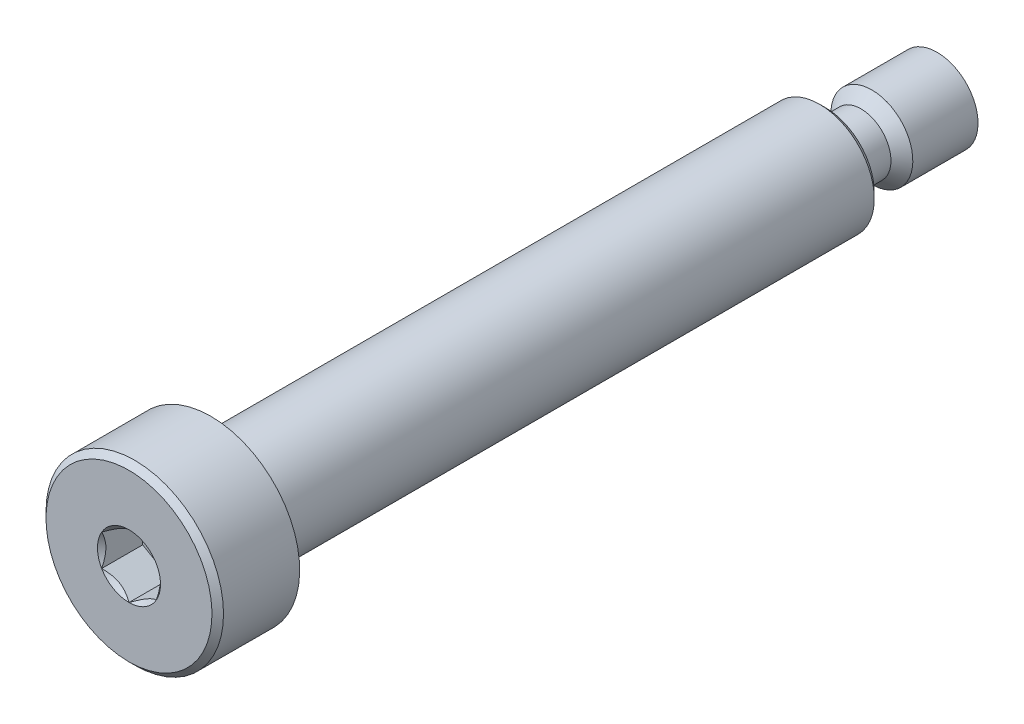
ISO-10303-21;
HEADER;
FILE_DESCRIPTION(('STEP AP214'),'2;1');
FILE_NAME('part.step','',(''),(''),'','','');
FILE_SCHEMA(('AUTOMOTIVE_DESIGN { 1 0 10303 214 1 1 1 1 }'));
ENDSEC;
DATA;
#1=APPLICATION_CONTEXT('core data for automotive mechanical design processes');
#2=APPLICATION_PROTOCOL_DEFINITION('international standard','automotive_design',2000,#1);
#3=PRODUCT_CONTEXT('',#1,'mechanical');
#4=PRODUCT('Part','Part','',(#3));
#5=PRODUCT_RELATED_PRODUCT_CATEGORY('part','',(#4));
#6=PRODUCT_DEFINITION_FORMATION('','',#4);
#7=PRODUCT_DEFINITION_CONTEXT('part definition',#1,'design');
#8=PRODUCT_DEFINITION('design','',#6,#7);
#9=PRODUCT_DEFINITION_SHAPE('','',#8);
#10=(LENGTH_UNIT() NAMED_UNIT(*) SI_UNIT(.MILLI.,.METRE.));
#11=(NAMED_UNIT(*) PLANE_ANGLE_UNIT() SI_UNIT($,.RADIAN.));
#12=(NAMED_UNIT(*) SI_UNIT($,.STERADIAN.) SOLID_ANGLE_UNIT());
#13=UNCERTAINTY_MEASURE_WITH_UNIT(LENGTH_MEASURE(1.E-05),#10,'distance_accuracy_value','');
#14=(GEOMETRIC_REPRESENTATION_CONTEXT(3) GLOBAL_UNCERTAINTY_ASSIGNED_CONTEXT((#13)) GLOBAL_UNIT_ASSIGNED_CONTEXT((#10,
#11,#12)) REPRESENTATION_CONTEXT('',''));
#15=CARTESIAN_POINT('',(0.,0.,0.));
#16=DIRECTION('',(0.,0.,1.));
#17=DIRECTION('',(1.,0.,0.));
#18=AXIS2_PLACEMENT_3D('',#15,#16,#17);
#19=CARTESIAN_POINT('',(0.,0.,-31.));
#20=DIRECTION('',(0.,0.,-1.));
#21=DIRECTION('',(0.,1.,0.));
#22=AXIS2_PLACEMENT_3D('',#19,#20,#21);
#23=CYLINDRICAL_SURFACE('',#22,3.);
#24=CARTESIAN_POINT('',(0.,0.,-23.4));
#25=DIRECTION('',(0.,0.,-1.));
#26=DIRECTION('',(0.,1.,0.));
#27=AXIS2_PLACEMENT_3D('',#24,#25,#26);
#28=CIRCLE('',#27,3.);
#29=CARTESIAN_POINT('',(0.,2.99999999999999,-23.4));
#30=VERTEX_POINT('',#29);
#31=EDGE_CURVE('E267',#30,#30,#28,.F.);
#32=ORIENTED_EDGE('',*,*,#31,.F.);
#33=EDGE_LOOP('',(#32));
#34=FACE_BOUND('',#33,.T.);
#35=CARTESIAN_POINT('',(0.,0.,-28.175));
#36=DIRECTION('',(0.,0.,-1.));
#37=DIRECTION('',(0.,1.,0.));
#38=AXIS2_PLACEMENT_3D('',#35,#36,#37);
#39=CIRCLE('',#38,3.);
#40=CARTESIAN_POINT('',(0.,3.,-28.175));
#41=VERTEX_POINT('',#40);
#42=EDGE_CURVE('E41',#41,#41,#39,.F.);
#43=ORIENTED_EDGE('',*,*,#42,.T.);
#44=EDGE_LOOP('',(#43));
#45=FACE_BOUND('',#44,.T.);
#46=ADVANCED_FACE('F37',(#34,#45),#23,.T.);
#47=CARTESIAN_POINT('',(0.,0.,-31.));
#48=DIRECTION('',(0.,0.,-1.));
#49=DIRECTION('',(0.,1.,0.));
#50=AXIS2_PLACEMENT_3D('',#47,#48,#49);
#51=CYLINDRICAL_SURFACE('',#50,3.99999999999999);
#52=CARTESIAN_POINT('',(0.,0.,-19.5775));
#53=DIRECTION('',(0.,0.,-1.));
#54=DIRECTION('',(0.,1.,0.));
#55=AXIS2_PLACEMENT_3D('',#52,#53,#54);
#56=CIRCLE('',#55,3.99999999999999);
#57=CARTESIAN_POINT('',(0.,3.99999999999999,-19.5775));
#58=VERTEX_POINT('',#57);
#59=EDGE_CURVE('E255',#58,#58,#56,.F.);
#60=ORIENTED_EDGE('',*,*,#59,.T.);
#61=EDGE_LOOP('',(#60));
#62=FACE_BOUND('',#61,.T.);
#63=CARTESIAN_POINT('',(0.,0.,23.8733333333333));
#64=DIRECTION('',(0.,0.,-1.));
#65=DIRECTION('',(0.,1.,0.));
#66=AXIS2_PLACEMENT_3D('',#63,#64,#65);
#67=CIRCLE('',#66,3.99999999999999);
#68=CARTESIAN_POINT('',(0.,3.99999999999998,23.8733333333333));
#69=VERTEX_POINT('',#68);
#70=EDGE_CURVE('E278',#69,#69,#67,.T.);
#71=ORIENTED_EDGE('',*,*,#70,.T.);
#72=EDGE_LOOP('',(#71));
#73=FACE_BOUND('',#72,.T.);
#74=ADVANCED_FACE('F203',(#62,#73),#51,.T.);
#75=CARTESIAN_POINT('',(0.,-4.,-20.));
#76=DIRECTION('',(0.,0.,-1.));
#77=DIRECTION('',(0.,1.,0.));
#78=AXIS2_PLACEMENT_3D('',#75,#76,#77);
#79=PLANE('',#78);
#80=CARTESIAN_POINT('',(0.,0.,-20.));
#81=DIRECTION('',(0.,0.,-1.));
#82=DIRECTION('',(0.,1.,0.));
#83=AXIS2_PLACEMENT_3D('',#80,#81,#82);
#84=CIRCLE('',#83,3.57749999999999);
#85=CARTESIAN_POINT('',(0.,3.57749999999999,-20.));
#86=VERTEX_POINT('',#85);
#87=EDGE_CURVE('E258',#86,#86,#84,.T.);
#88=ORIENTED_EDGE('',*,*,#87,.T.);
#89=EDGE_LOOP('',(#88));
#90=FACE_BOUND('',#89,.T.);
#91=CARTESIAN_POINT('',(0.,0.,-20.));
#92=DIRECTION('',(0.,0.,-1.));
#93=DIRECTION('',(0.,1.,0.));
#94=AXIS2_PLACEMENT_3D('',#91,#92,#93);
#95=CIRCLE('',#94,3.);
#96=CARTESIAN_POINT('',(0.,3.,-20.));
#97=VERTEX_POINT('',#96);
#98=EDGE_CURVE('E348',#97,#97,#95,.T.);
#99=ORIENTED_EDGE('',*,*,#98,.F.);
#100=EDGE_LOOP('',(#99));
#101=FACE_BOUND('',#100,.T.);
#102=ADVANCED_FACE('F209',(#90,#101),#79,.T.);
#103=CARTESIAN_POINT('',(0.,0.,-31.));
#104=DIRECTION('',(0.,0.,-1.));
#105=DIRECTION('',(0.,1.,0.));
#106=AXIS2_PLACEMENT_3D('',#103,#104,#105);
#107=CYLINDRICAL_SURFACE('',#106,3.13333333333333);
#108=CARTESIAN_POINT('',(0.,0.,24.3933333333333));
#109=DIRECTION('',(0.,0.,-1.));
#110=DIRECTION('',(0.,1.,0.));
#111=AXIS2_PLACEMENT_3D('',#108,#109,#110);
#112=CIRCLE('',#111,3.13333333333333);
#113=CARTESIAN_POINT('',(0.,3.13333333333332,24.3933333333333));
#114=VERTEX_POINT('',#113);
#115=EDGE_CURVE('E259',#114,#114,#112,.F.);
#116=ORIENTED_EDGE('',*,*,#115,.T.);
#117=EDGE_LOOP('',(#116));
#118=FACE_BOUND('',#117,.T.);
#119=CARTESIAN_POINT('',(0.,0.,25.));
#120=DIRECTION('',(0.,0.,-1.));
#121=DIRECTION('',(0.,1.,0.));
#122=AXIS2_PLACEMENT_3D('',#119,#120,#121);
#123=CIRCLE('',#122,3.13333333333333);
#124=CARTESIAN_POINT('',(0.,3.13333333333332,25.));
#125=VERTEX_POINT('',#124);
#126=EDGE_CURVE('E279',#125,#125,#123,.T.);
#127=ORIENTED_EDGE('',*,*,#126,.T.);
#128=EDGE_LOOP('',(#127));
#129=FACE_BOUND('',#128,.T.);
#130=ADVANCED_FACE('F216',(#118,#129),#107,.T.);
#131=CARTESIAN_POINT('',(0.,3.99999999999998,24.1333333333333));
#132=DIRECTION('',(0.,0.,-1.));
#133=DIRECTION('',(0.,1.,0.));
#134=AXIS2_PLACEMENT_3D('',#131,#132,#133);
#135=PLANE('',#134);
#136=CARTESIAN_POINT('',(0.,0.,24.1333333333333));
#137=DIRECTION('',(0.,0.,-1.));
#138=DIRECTION('',(0.,1.,0.));
#139=AXIS2_PLACEMENT_3D('',#136,#137,#138);
#140=CIRCLE('',#139,3.74000000000001);
#141=CARTESIAN_POINT('',(0.,3.74,24.1333333333333));
#142=VERTEX_POINT('',#141);
#143=EDGE_CURVE('E264',#142,#142,#140,.F.);
#144=ORIENTED_EDGE('',*,*,#143,.T.);
#145=EDGE_LOOP('',(#144));
#146=FACE_BOUND('',#145,.T.);
#147=CARTESIAN_POINT('',(0.,0.,24.1333333333333));
#148=DIRECTION('',(0.,0.,-1.));
#149=DIRECTION('',(0.,1.,0.));
#150=AXIS2_PLACEMENT_3D('',#147,#148,#149);
#151=CIRCLE('',#150,3.39333333333332);
#152=CARTESIAN_POINT('',(0.,3.39333333333331,24.1333333333333));
#153=VERTEX_POINT('',#152);
#154=EDGE_CURVE('E282',#153,#153,#151,.T.);
#155=ORIENTED_EDGE('',*,*,#154,.T.);
#156=EDGE_LOOP('',(#155));
#157=FACE_BOUND('',#156,.T.);
#158=ADVANCED_FACE('F232',(#146,#157),#135,.F.);
#159=CARTESIAN_POINT('',(0.,0.,31.));
#160=DIRECTION('',(0.,0.,1.));
#161=DIRECTION('',(0.,-1.,0.));
#162=AXIS2_PLACEMENT_3D('',#159,#160,#161);
#163=PLANE('',#162);
#164=CARTESIAN_POINT('',(0.,0.,31.));
#165=DIRECTION('',(0.,0.,1.));
#166=DIRECTION('',(1.,0.,0.));
#167=AXIS2_PLACEMENT_3D('',#164,#165,#166);
#168=CIRCLE('',#167,2.3094010767585);
#169=CARTESIAN_POINT('',(0.,-2.3094010767585,31.));
#170=VERTEX_POINT('',#169);
#171=CARTESIAN_POINT('',(1.99999999999999,-1.15470053837926,31.));
#172=VERTEX_POINT('',#171);
#173=EDGE_CURVE('E52',#170,#172,#168,.T.);
#174=ORIENTED_EDGE('',*,*,#173,.F.);
#175=CARTESIAN_POINT('',(-2.,-1.15470053837926,31.));
#176=VERTEX_POINT('',#175);
#177=EDGE_CURVE('E59',#176,#170,#168,.T.);
#178=ORIENTED_EDGE('',*,*,#177,.F.);
#179=CARTESIAN_POINT('',(-2.,1.15470053837925,31.));
#180=VERTEX_POINT('',#179);
#181=EDGE_CURVE('E133',#180,#176,#168,.T.);
#182=ORIENTED_EDGE('',*,*,#181,.F.);
#183=CARTESIAN_POINT('',(0.,2.3094010767585,31.));
#184=VERTEX_POINT('',#183);
#185=EDGE_CURVE('E128',#184,#180,#168,.T.);
#186=ORIENTED_EDGE('',*,*,#185,.F.);
#187=CARTESIAN_POINT('',(2.,1.15470053837925,31.));
#188=VERTEX_POINT('',#187);
#189=EDGE_CURVE('E100',#188,#184,#168,.T.);
#190=ORIENTED_EDGE('',*,*,#189,.F.);
#191=EDGE_CURVE('E91',#172,#188,#168,.T.);
#192=ORIENTED_EDGE('',*,*,#191,.F.);
#193=EDGE_LOOP('',(#174,#178,#182,#186,#190,#192));
#194=FACE_BOUND('',#193,.T.);
#195=CARTESIAN_POINT('',(0.,0.,31.));
#196=DIRECTION('',(0.,0.,1.));
#197=DIRECTION('',(0.,-1.,0.));
#198=AXIS2_PLACEMENT_3D('',#195,#196,#197);
#199=CIRCLE('',#198,6.07749999999998);
#200=CARTESIAN_POINT('',(0.,-6.07749999999999,31.));
#201=VERTEX_POINT('',#200);
#202=EDGE_CURVE('E46',#201,#201,#199,.T.);
#203=ORIENTED_EDGE('',*,*,#202,.T.);
#204=EDGE_LOOP('',(#203));
#205=FACE_BOUND('',#204,.T.);
#206=ADVANCED_FACE('F125',(#194,#205),#163,.T.);
#207=CARTESIAN_POINT('',(0.,0.,-31.));
#208=DIRECTION('',(0.,0.,-1.));
#209=DIRECTION('',(0.,1.,0.));
#210=AXIS2_PLACEMENT_3D('',#207,#208,#209);
#211=CYLINDRICAL_SURFACE('',#210,6.49999999999999);
#212=CARTESIAN_POINT('',(0.,0.,30.5775));
#213=DIRECTION('',(0.,0.,1.));
#214=DIRECTION('',(0.,-1.,0.));
#215=AXIS2_PLACEMENT_3D('',#212,#213,#214);
#216=CIRCLE('',#215,6.49999999999999);
#217=CARTESIAN_POINT('',(0.,-6.5,30.5775));
#218=VERTEX_POINT('',#217);
#219=EDGE_CURVE('E261',#218,#218,#216,.F.);
#220=ORIENTED_EDGE('',*,*,#219,.T.);
#221=EDGE_LOOP('',(#220));
#222=FACE_BOUND('',#221,.T.);
#223=CARTESIAN_POINT('',(0.,0.,25.));
#224=DIRECTION('',(0.,0.,-1.));
#225=DIRECTION('',(0.,1.,0.));
#226=AXIS2_PLACEMENT_3D('',#223,#224,#225);
#227=CIRCLE('',#226,6.49999999999999);
#228=CARTESIAN_POINT('',(0.,6.49999999999998,25.));
#229=VERTEX_POINT('',#228);
#230=EDGE_CURVE('E277',#229,#229,#227,.T.);
#231=ORIENTED_EDGE('',*,*,#230,.F.);
#232=EDGE_LOOP('',(#231));
#233=FACE_BOUND('',#232,.T.);
#234=ADVANCED_FACE('F225',(#222,#233),#211,.T.);
#235=CARTESIAN_POINT('',(0.,-6.5,25.));
#236=DIRECTION('',(0.,0.,-1.));
#237=DIRECTION('',(0.,1.,0.));
#238=AXIS2_PLACEMENT_3D('',#235,#236,#237);
#239=PLANE('',#238);
#240=ORIENTED_EDGE('',*,*,#230,.T.);
#241=EDGE_LOOP('',(#240));
#242=FACE_BOUND('',#241,.T.);
#243=ORIENTED_EDGE('',*,*,#126,.F.);
#244=EDGE_LOOP('',(#243));
#245=FACE_BOUND('',#244,.T.);
#246=ADVANCED_FACE('F221',(#242,#245),#239,.T.);
#247=CARTESIAN_POINT('',(0.,0.,23.8733333333333));
#248=DIRECTION('',(0.,0.,-1.));
#249=DIRECTION('',(0.,1.,0.));
#250=AXIS2_PLACEMENT_3D('',#247,#248,#249);
#251=CONICAL_SURFACE('',#250,3.99999999999999,0.785398163397443);
#252=ORIENTED_EDGE('',*,*,#143,.F.);
#253=EDGE_LOOP('',(#252));
#254=FACE_BOUND('',#253,.T.);
#255=ORIENTED_EDGE('',*,*,#70,.F.);
#256=EDGE_LOOP('',(#255));
#257=FACE_BOUND('',#256,.T.);
#258=ADVANCED_FACE('F224',(#254,#257),#251,.T.);
#259=CARTESIAN_POINT('',(0.,0.,24.1333333333333));
#260=DIRECTION('',(0.,0.,-1.));
#261=DIRECTION('',(0.,1.,0.));
#262=AXIS2_PLACEMENT_3D('',#259,#260,#261);
#263=CONICAL_SURFACE('',#262,3.39333333333332,0.785398163397451);
#264=ORIENTED_EDGE('',*,*,#115,.F.);
#265=EDGE_LOOP('',(#264));
#266=FACE_BOUND('',#265,.T.);
#267=ORIENTED_EDGE('',*,*,#154,.F.);
#268=EDGE_LOOP('',(#267));
#269=FACE_BOUND('',#268,.T.);
#270=ADVANCED_FACE('F235',(#266,#269),#263,.T.);
#271=CARTESIAN_POINT('',(0.,0.,-20.8));
#272=DIRECTION('',(0.,0.,-1.));
#273=DIRECTION('',(0.,1.,0.));
#274=AXIS2_PLACEMENT_3D('',#271,#272,#273);
#275=TOROIDAL_SURFACE('',#274,3.,0.800000000000015);
#276=CARTESIAN_POINT('',(0.,0.,-20.8));
#277=DIRECTION('',(0.,0.,-1.));
#278=DIRECTION('',(0.,1.,0.));
#279=AXIS2_PLACEMENT_3D('',#276,#277,#278);
#280=CIRCLE('',#279,2.19999999999999);
#281=CARTESIAN_POINT('',(0.,2.19999999999998,-20.8));
#282=VERTEX_POINT('',#281);
#283=EDGE_CURVE('E346',#282,#282,#280,.T.);
#284=ORIENTED_EDGE('',*,*,#283,.F.);
#285=EDGE_LOOP('',(#284));
#286=FACE_BOUND('',#285,.T.);
#287=ORIENTED_EDGE('',*,*,#98,.T.);
#288=EDGE_LOOP('',(#287));
#289=FACE_BOUND('',#288,.T.);
#290=ADVANCED_FACE('F238',(#286,#289),#275,.F.);
#291=CARTESIAN_POINT('',(0.,0.,-31.));
#292=DIRECTION('',(0.,0.,-1.));
#293=DIRECTION('',(0.,1.,0.));
#294=AXIS2_PLACEMENT_3D('',#291,#292,#293);
#295=CYLINDRICAL_SURFACE('',#294,2.19999999999999);
#296=CARTESIAN_POINT('',(0.,0.,-22.6));
#297=DIRECTION('',(0.,0.,-1.));
#298=DIRECTION('',(0.,1.,0.));
#299=AXIS2_PLACEMENT_3D('',#296,#297,#298);
#300=CIRCLE('',#299,2.19999999999999);
#301=CARTESIAN_POINT('',(0.,2.19999999999998,-22.6));
#302=VERTEX_POINT('',#301);
#303=EDGE_CURVE('E335',#302,#302,#300,.T.);
#304=ORIENTED_EDGE('',*,*,#303,.F.);
#305=EDGE_LOOP('',(#304));
#306=FACE_BOUND('',#305,.T.);
#307=ORIENTED_EDGE('',*,*,#283,.T.);
#308=EDGE_LOOP('',(#307));
#309=FACE_BOUND('',#308,.T.);
#310=ADVANCED_FACE('F249',(#306,#309),#295,.T.);
#311=CARTESIAN_POINT('',(0.,0.,-22.6));
#312=DIRECTION('',(0.,0.,-1.));
#313=DIRECTION('',(0.,1.,0.));
#314=AXIS2_PLACEMENT_3D('',#311,#312,#313);
#315=CONICAL_SURFACE('',#314,2.19999999999999,0.785398163397443);
#316=ORIENTED_EDGE('',*,*,#31,.T.);
#317=EDGE_LOOP('',(#316));
#318=FACE_BOUND('',#317,.T.);
#319=ORIENTED_EDGE('',*,*,#303,.T.);
#320=EDGE_LOOP('',(#319));
#321=FACE_BOUND('',#320,.T.);
#322=ADVANCED_FACE('F242',(#318,#321),#315,.T.);
#323=CARTESIAN_POINT('',(0.,0.,-20.));
#324=DIRECTION('',(0.,0.,1.));
#325=DIRECTION('',(0.,-1.,0.));
#326=AXIS2_PLACEMENT_3D('',#323,#324,#325);
#327=CONICAL_SURFACE('',#326,3.57749999999999,0.785398163397441);
#328=ORIENTED_EDGE('',*,*,#59,.F.);
#329=EDGE_LOOP('',(#328));
#330=FACE_BOUND('',#329,.T.);
#331=ORIENTED_EDGE('',*,*,#87,.F.);
#332=EDGE_LOOP('',(#331));
#333=FACE_BOUND('',#332,.T.);
#334=ADVANCED_FACE('F240',(#330,#333),#327,.T.);
#335=CARTESIAN_POINT('',(0.,0.,30.5775));
#336=DIRECTION('',(0.,0.,-1.));
#337=DIRECTION('',(0.,1.,0.));
#338=AXIS2_PLACEMENT_3D('',#335,#336,#337);
#339=CONICAL_SURFACE('',#338,6.49999999999999,0.785398163397444);
#340=ORIENTED_EDGE('',*,*,#202,.F.);
#341=EDGE_LOOP('',(#340));
#342=FACE_BOUND('',#341,.T.);
#343=ORIENTED_EDGE('',*,*,#219,.F.);
#344=EDGE_LOOP('',(#343));
#345=FACE_BOUND('',#344,.T.);
#346=ADVANCED_FACE('F39',(#342,#345),#339,.T.);
#347=CARTESIAN_POINT('',(0.,0.,31.));
#348=DIRECTION('',(0.,0.,1.));
#349=DIRECTION('',(1.,0.,0.));
#350=AXIS2_PLACEMENT_3D('',#347,#348,#349);
#351=CONICAL_SURFACE('',#350,2.3094010767585,0.78539816339745);
#352=ORIENTED_EDGE('',*,*,#189,.T.);
#353=CARTESIAN_POINT('',(2.0002,1.15458506832541,31.0001154787137));
#354=CARTESIAN_POINT('',(1.93144696596929,1.19427965103064,30.9604530902256));
#355=CARTESIAN_POINT('',(1.86154425786449,1.23463799837203,30.9231199822842));
#356=CARTESIAN_POINT('',(1.71900475544956,1.31693321846145,30.8547636851361));
#357=CARTESIAN_POINT('',(1.64635440243464,1.35887791933133,30.8237785337372));
#358=CARTESIAN_POINT('',(1.49985839894603,1.44345742638069,30.7707002165441));
#359=CARTESIAN_POINT('',(1.42605006475371,1.48607068799506,30.7484736271766));
#360=CARTESIAN_POINT('',(1.27680836816474,1.57223542169502,30.7142288166751));
#361=CARTESIAN_POINT('',(1.20137956608185,1.61578426088223,30.7021850291441));
#362=CARTESIAN_POINT('',(1.07138449932892,1.69083694766535,30.6913185119056));
#363=CARTESIAN_POINT('',(1.01698621602989,1.7222438111715,30.68970975361));
#364=CARTESIAN_POINT('',(0.908278544480307,1.78500621460363,30.6924188775987));
#365=CARTESIAN_POINT('',(0.853969194078662,1.81636173267754,30.696738837758));
#366=CARTESIAN_POINT('',(0.745863272410663,1.87877671565355,30.7110595674099));
#367=CARTESIAN_POINT('',(0.692067343445208,1.90983580972306,30.721066692762));
#368=CARTESIAN_POINT('',(0.585405737694427,1.97141691651547,30.7462124302497));
#369=CARTESIAN_POINT('',(0.532539989929288,2.00193897021858,30.7613506490422));
#370=CARTESIAN_POINT('',(0.397120266910157,2.08012358375726,30.8062945034292));
#371=CARTESIAN_POINT('',(0.315406165150523,2.12730124240478,30.8394888394258));
#372=CARTESIAN_POINT('',(0.195252962742199,2.19667172615922,30.8955258231714));
#373=CARTESIAN_POINT('',(0.155657147890824,2.21953238052244,30.9152147029469));
#374=CARTESIAN_POINT('',(0.0771990411121287,2.26483018959123,30.9563873183649));
#375=CARTESIAN_POINT('',(0.0383363164062606,2.28726759416161,30.9778699516512));
#376=CARTESIAN_POINT('',(-0.000199999999998363,2.30951654681234,31.0001154787137));
#377=B_SPLINE_CURVE_WITH_KNOTS('',3,(#353,#354,#355,#356,#357,#358,#359,#360,#361,#362,#363,
#364,#365,#366,#367,#368,#369,#370,#371,#372,#373,#374,#375,#376),.UNSPECIFIED.,.F.,.F.,(4,2,2,
2,2,2,2,2,2,2,2,4),(0.,0.266420613771064,0.53439375152339,0.798110374376915,1.06116288956936,
1.24939906803722,1.43770123566247,1.62621426093932,1.81471283831913,2.11415604834145,
2.2634717071779,2.41269626969771),.UNSPECIFIED.);
#378=EDGE_CURVE('E13',#188,#184,#377,.T.);
#379=ORIENTED_EDGE('',*,*,#378,.F.);
#380=EDGE_LOOP('',(#352,#379));
#381=FACE_BOUND('',#380,.T.);
#382=ADVANCED_FACE('F103',(#381),#351,.F.);
#383=ORIENTED_EDGE('',*,*,#185,.T.);
#384=CARTESIAN_POINT('',(0.000200000000001366,2.30951654681234,31.0001154787137));
#385=CARTESIAN_POINT('',(-0.0685530340307045,2.2698219641071,30.9604530902256));
#386=CARTESIAN_POINT('',(-0.138455742135511,2.22946361676571,30.9231199822842));
#387=CARTESIAN_POINT('',(-0.280995244550435,2.1471683966763,30.8547636851361));
#388=CARTESIAN_POINT('',(-0.353645597565357,2.10522369580641,30.8237785337372));
#389=CARTESIAN_POINT('',(-0.50014160105397,2.02064418875706,30.7707002165441));
#390=CARTESIAN_POINT('',(-0.573949935246293,1.97803092714268,30.7484736271766));
#391=CARTESIAN_POINT('',(-0.723191631835262,1.89186619344272,30.7142288166751));
#392=CARTESIAN_POINT('',(-0.79862043391815,1.84831735425552,30.7021850291441));
#393=CARTESIAN_POINT('',(-0.928615500671077,1.77326466747239,30.6913185119056));
#394=CARTESIAN_POINT('',(-0.983013783970107,1.74185780396624,30.68970975361));
#395=CARTESIAN_POINT('',(-1.09172145551969,1.67909540053411,30.6924188775987));
#396=CARTESIAN_POINT('',(-1.14603080592134,1.64773988246021,30.696738837758));
#397=CARTESIAN_POINT('',(-1.25413672758934,1.5853248994842,30.7110595674099));
#398=CARTESIAN_POINT('',(-1.30793265655479,1.55426580541469,30.721066692762));
#399=CARTESIAN_POINT('',(-1.41459426230557,1.49268469862228,30.7462124302497));
#400=CARTESIAN_POINT('',(-1.46746001007071,1.46216264491916,30.7613506490422));
#401=CARTESIAN_POINT('',(-1.60287973308984,1.38397803138048,30.8062945034292));
#402=CARTESIAN_POINT('',(-1.68459383484948,1.33680037273297,30.8394888394258));
#403=CARTESIAN_POINT('',(-1.8047470372578,1.26742988897853,30.8955258231714));
#404=CARTESIAN_POINT('',(-1.84434285210918,1.2445692346153,30.9152147029469));
#405=CARTESIAN_POINT('',(-1.92280095888787,1.19927142554651,30.9563873183649));
#406=CARTESIAN_POINT('',(-1.96166368359374,1.17683402097614,30.9778699516513));
#407=CARTESIAN_POINT('',(-2.0002,1.15458506832541,31.0001154787137));
#408=B_SPLINE_CURVE_WITH_KNOTS('',3,(#384,#385,#386,#387,#388,#389,#390,#391,#392,#393,#394,
#395,#396,#397,#398,#399,#400,#401,#402,#403,#404,#405,#406,#407),.UNSPECIFIED.,.F.,.F.,(4,2,2,
2,2,2,2,2,2,2,2,4),(0.,0.266420613771064,0.534393751523389,0.798110374376914,1.06116288956936,
1.24939906803722,1.43770123566247,1.62621426093931,1.81471283831913,2.11415604834145,
2.26347170717791,2.41269626969771),.UNSPECIFIED.);
#409=EDGE_CURVE('E129',#184,#180,#408,.T.);
#410=ORIENTED_EDGE('',*,*,#409,.F.);
#411=EDGE_LOOP('',(#383,#410));
#412=FACE_BOUND('',#411,.T.);
#413=ADVANCED_FACE('F369',(#412),#351,.F.);
#414=ORIENTED_EDGE('',*,*,#181,.T.);
#415=CARTESIAN_POINT('',(-2.,-2.30294417292924,31.7407713550277));
#416=CARTESIAN_POINT('',(-2.,-2.24687002663712,31.698443273626));
#417=CARTESIAN_POINT('',(-2.,-2.19048190536959,31.6565251568643));
#418=CARTESIAN_POINT('',(-2.,-2.07695390496424,31.573690417861));
#419=CARTESIAN_POINT('',(-2.,-2.01981384066454,31.5327740496681));
#420=CARTESIAN_POINT('',(-2.,-1.90424016804776,31.4518334520186));
#421=CARTESIAN_POINT('',(-2.,-1.8457999674391,31.4118185915599));
#422=CARTESIAN_POINT('',(-2.,-1.72792745461761,31.3332889936643));
#423=CARTESIAN_POINT('',(-2.,-1.66849521292324,31.2947741502431));
#424=CARTESIAN_POINT('',(-2.,-1.4816299571002,31.1776406516043));
#425=CARTESIAN_POINT('',(-2.,-1.35220318163536,31.1021459017296));
#426=CARTESIAN_POINT('',(-2.,-1.08689521592925,30.9640493509944));
#427=CARTESIAN_POINT('',(-2.,-0.951037763938195,30.9014040859035));
#428=CARTESIAN_POINT('',(-2.,-0.747111912259413,30.8247635438751));
#429=CARTESIAN_POINT('',(-2.,-0.68206403414788,30.8027671799191));
#430=CARTESIAN_POINT('',(-2.,-0.550398103294756,30.7639966876601));
#431=CARTESIAN_POINT('',(-2.,-0.483779942722479,30.7472229191212));
#432=CARTESIAN_POINT('',(-2.,-0.350484328847658,30.7200482578844));
#433=CARTESIAN_POINT('',(-2.,-0.283829489364789,30.7095381767417));
#434=CARTESIAN_POINT('',(-2.,-0.149806987139379,30.6950960855449));
#435=CARTESIAN_POINT('',(-2.,-0.0824394489341244,30.6911629447331));
#436=CARTESIAN_POINT('',(-2.,0.0499055622944873,30.6901664769337));
#437=CARTESIAN_POINT('',(-2.,0.11488128514317,30.6928596448504));
#438=CARTESIAN_POINT('',(-2.,0.244275921482758,30.7044300704227));
#439=CARTESIAN_POINT('',(-2.,0.308694780266751,30.7133079288332));
#440=CARTESIAN_POINT('',(-2.,0.437599788610702,30.7369136592961));
#441=CARTESIAN_POINT('',(-2.,0.502067428644592,30.7517410834465));
#442=CARTESIAN_POINT('',(-2.,0.629594322598304,30.786457883628));
#443=CARTESIAN_POINT('',(-2.,0.692653693883148,30.8063468361063));
#444=CARTESIAN_POINT('',(-2.,0.891187889210543,30.8764469792562));
#445=CARTESIAN_POINT('',(-2.,1.02383545707306,30.9346418003215));
#446=CARTESIAN_POINT('',(-2.,1.28290932150074,31.0640305754596));
#447=CARTESIAN_POINT('',(-2.,1.4093111258757,31.1352712314148));
#448=CARTESIAN_POINT('',(-2.,1.59200441438963,31.2464419918747));
#449=CARTESIAN_POINT('',(-2.,1.65027549026191,31.2831821903374));
#450=CARTESIAN_POINT('',(-2.,1.76581760389243,31.3582145141838));
#451=CARTESIAN_POINT('',(-2.,1.82308856543105,31.396506757118));
#452=CARTESIAN_POINT('',(-2.,1.93629654762084,31.4740422640812));
#453=CARTESIAN_POINT('',(-2.,1.99224062500539,31.5132752761336));
#454=CARTESIAN_POINT('',(-2.,2.103364240299,31.5927788307365));
#455=CARTESIAN_POINT('',(-2.,2.15854398422468,31.6330490850006));
#456=CARTESIAN_POINT('',(-2.,2.21340370692659,31.6737442381459));
#457=B_SPLINE_CURVE_WITH_KNOTS('',3,(#415,#416,#417,#418,#419,#420,#421,#422,#423,#424,#425,
#426,#427,#428,#429,#430,#431,#432,#433,#434,#435,#436,#437,#438,#439,#440,#441,#442,#443,#444,
#445,#446,#447,#448,#449,#450,#451,#452,#453,#454,#455,#456),.UNSPECIFIED.,.F.,.F.,(4,2,2,2,2,2,
2,2,2,2,2,2,2,2,2,2,2,2,2,2,4),(0.,0.210772731976894,0.421598374658588,0.634057554623488,
0.846501695870172,1.29562155455624,1.74319622821645,1.94902062110207,2.15485918928326,
2.35699582502635,2.5590977043214,2.75388435553556,2.94868993014815,3.14690093452586,
3.34509535789702,3.77838155837654,4.21325029921626,4.41989056685647,4.62654651460922,
4.8315237711129,5.03644465914086),.UNSPECIFIED.);
#458=EDGE_CURVE('E131',#180,#176,#457,.F.);
#459=ORIENTED_EDGE('',*,*,#458,.F.);
#460=EDGE_LOOP('',(#414,#459));
#461=FACE_BOUND('',#460,.T.);
#462=ADVANCED_FACE('F366',(#461),#351,.F.);
#463=ORIENTED_EDGE('',*,*,#177,.T.);
#464=CARTESIAN_POINT('',(-2.0002,-1.15458506832542,31.0001154787137));
#465=CARTESIAN_POINT('',(-1.93144696596929,-1.19427965103065,30.9604530902256));
#466=CARTESIAN_POINT('',(-1.86154425786449,-1.23463799837204,30.9231199822842));
#467=CARTESIAN_POINT('',(-1.71900475544956,-1.31693321846145,30.8547636851361));
#468=CARTESIAN_POINT('',(-1.64635440243464,-1.35887791933134,30.8237785337372));
#469=CARTESIAN_POINT('',(-1.49985839894603,-1.4434574263807,30.7707002165441));
#470=CARTESIAN_POINT('',(-1.42605006475371,-1.48607068799507,30.7484736271766));
#471=CARTESIAN_POINT('',(-1.27680836816474,-1.57223542169503,30.7142288166751));
#472=CARTESIAN_POINT('',(-1.20137956608185,-1.61578426088224,30.7021850291441));
#473=CARTESIAN_POINT('',(-1.07138449932892,-1.69083694766536,30.6913185119056));
#474=CARTESIAN_POINT('',(-1.01698621602989,-1.72224381117151,30.68970975361));
#475=CARTESIAN_POINT('',(-0.908278544480308,-1.78500621460364,30.6924188775987));
#476=CARTESIAN_POINT('',(-0.853969194078663,-1.81636173267754,30.696738837758));
#477=CARTESIAN_POINT('',(-0.745863272410664,-1.87877671565356,30.7110595674099));
#478=CARTESIAN_POINT('',(-0.69206734344521,-1.90983580972307,30.721066692762));
#479=CARTESIAN_POINT('',(-0.585405737694428,-1.97141691651548,30.7462124302497));
#480=CARTESIAN_POINT('',(-0.532539989929289,-2.00193897021859,30.7613506490422));
#481=CARTESIAN_POINT('',(-0.397120266910158,-2.08012358375727,30.8062945034292));
#482=CARTESIAN_POINT('',(-0.315406165150523,-2.12730124240479,30.8394888394258));
#483=CARTESIAN_POINT('',(-0.195252962742198,-2.19667172615923,30.8955258231714));
#484=CARTESIAN_POINT('',(-0.155657147890823,-2.21953238052245,30.9152147029469));
#485=CARTESIAN_POINT('',(-0.0771990411121275,-2.26483018959124,30.9563873183649));
#486=CARTESIAN_POINT('',(-0.0383363164062592,-2.28726759416161,30.9778699516513));
#487=CARTESIAN_POINT('',(0.00019999999999987,-2.30951654681235,31.0001154787137));
#488=B_SPLINE_CURVE_WITH_KNOTS('',3,(#464,#465,#466,#467,#468,#469,#470,#471,#472,#473,#474,
#475,#476,#477,#478,#479,#480,#481,#482,#483,#484,#485,#486,#487),.UNSPECIFIED.,.F.,.F.,(4,2,2,
2,2,2,2,2,2,2,2,4),(0.,0.266420613771063,0.534393751523386,0.798110374376911,1.06116288956936,
1.24939906803721,1.43770123566247,1.62621426093931,1.81471283831913,2.11415604834145,
2.2634717071779,2.41269626969771),.UNSPECIFIED.);
#489=EDGE_CURVE('E168',#176,#170,#488,.T.);
#490=ORIENTED_EDGE('',*,*,#489,.F.);
#491=EDGE_LOOP('',(#463,#490));
#492=FACE_BOUND('',#491,.T.);
#493=ADVANCED_FACE('F368',(#492),#351,.F.);
#494=ORIENTED_EDGE('',*,*,#173,.T.);
#495=CARTESIAN_POINT('',(-0.000200000000000007,-2.30951654681235,31.0001154787137));
#496=CARTESIAN_POINT('',(0.0685530340307058,-2.26982196410711,30.9604530902256));
#497=CARTESIAN_POINT('',(0.138455742135512,-2.22946361676572,30.9231199822842));
#498=CARTESIAN_POINT('',(0.280995244550436,-2.14716839667631,30.8547636851361));
#499=CARTESIAN_POINT('',(0.353645597565358,-2.10522369580642,30.8237785337372));
#500=CARTESIAN_POINT('',(0.500141601053971,-2.02064418875707,30.7707002165441));
#501=CARTESIAN_POINT('',(0.573949935246294,-1.97803092714269,30.7484736271766));
#502=CARTESIAN_POINT('',(0.723191631835263,-1.89186619344273,30.7142288166751));
#503=CARTESIAN_POINT('',(0.798620433918151,-1.84831735425553,30.7021850291441));
#504=CARTESIAN_POINT('',(0.928615500671078,-1.7732646674724,30.6913185119056));
#505=CARTESIAN_POINT('',(0.983013783970108,-1.74185780396625,30.68970975361));
#506=CARTESIAN_POINT('',(1.09172145551969,-1.67909540053412,30.6924188775987));
#507=CARTESIAN_POINT('',(1.14603080592134,-1.64773988246022,30.696738837758));
#508=CARTESIAN_POINT('',(1.25413672758934,-1.58532489948421,30.7110595674099));
#509=CARTESIAN_POINT('',(1.30793265655479,-1.5542658054147,30.721066692762));
#510=CARTESIAN_POINT('',(1.41459426230557,-1.49268469862228,30.7462124302497));
#511=CARTESIAN_POINT('',(1.46746001007071,-1.46216264491917,30.7613506490422));
#512=CARTESIAN_POINT('',(1.60287973308984,-1.38397803138049,30.8062945034292));
#513=CARTESIAN_POINT('',(1.68459383484948,-1.33680037273298,30.8394888394258));
#514=CARTESIAN_POINT('',(1.8047470372578,-1.26742988897854,30.8955258231714));
#515=CARTESIAN_POINT('',(1.84434285210918,-1.24456923461531,30.9152147029469));
#516=CARTESIAN_POINT('',(1.92280095888787,-1.19927142554652,30.9563873183649));
#517=CARTESIAN_POINT('',(1.96166368359374,-1.17683402097615,30.9778699516513));
#518=CARTESIAN_POINT('',(2.0002,-1.15458506832542,31.0001154787137));
#519=B_SPLINE_CURVE_WITH_KNOTS('',3,(#495,#496,#497,#498,#499,#500,#501,#502,#503,#504,#505,
#506,#507,#508,#509,#510,#511,#512,#513,#514,#515,#516,#517,#518),.UNSPECIFIED.,.F.,.F.,(4,2,2,
2,2,2,2,2,2,2,2,4),(0.,0.266420613771064,0.534393751523389,0.798110374376914,1.06116288956936,
1.24939906803722,1.43770123566247,1.62621426093932,1.81471283831913,2.11415604834145,
2.2634717071779,2.41269626969771),.UNSPECIFIED.);
#520=EDGE_CURVE('E115',#170,#172,#519,.T.);
#521=ORIENTED_EDGE('',*,*,#520,.F.);
#522=EDGE_LOOP('',(#494,#521));
#523=FACE_BOUND('',#522,.T.);
#524=ADVANCED_FACE('F155',(#523),#351,.F.);
#525=ORIENTED_EDGE('',*,*,#191,.T.);
#526=CARTESIAN_POINT('',(2.,-2.3029441732643,31.7407713552807));
#527=CARTESIAN_POINT('',(2.,-2.24687002696279,31.6984432738692));
#528=CARTESIAN_POINT('',(2.,-2.19048190568583,31.6565251570979));
#529=CARTESIAN_POINT('',(2.,-2.07695390526153,31.5736904180751));
#530=CARTESIAN_POINT('',(2.,-2.0198138409523,31.5327740498725));
#531=CARTESIAN_POINT('',(2.,-1.90424016831615,31.4518334522036));
#532=CARTESIAN_POINT('',(2.,-1.84579996769764,31.4118185917352));
#533=CARTESIAN_POINT('',(2.,-1.72792745485626,31.3332889938203));
#534=CARTESIAN_POINT('',(2.,-1.66849521315187,31.2947741503895));
#535=CARTESIAN_POINT('',(2.,-1.48162995729573,31.1776406517203));
#536=CARTESIAN_POINT('',(2.,-1.35220318180737,31.1021459018253));
#537=CARTESIAN_POINT('',(2.,-1.0868952160522,30.9640493510523));
#538=CARTESIAN_POINT('',(2.,-0.951037764035631,30.901404085944));
#539=CARTESIAN_POINT('',(2.,-0.747111912337651,30.8247635439028));
#540=CARTESIAN_POINT('',(2.,-0.682064034234156,30.8027671799472));
#541=CARTESIAN_POINT('',(2.,-0.550398103397371,30.7639966876876));
#542=CARTESIAN_POINT('',(2.,-0.483779942833395,30.7472229191476));
#543=CARTESIAN_POINT('',(2.,-0.350484328974903,30.7200482579067));
#544=CARTESIAN_POINT('',(2.,-0.283829489500057,30.709538176761));
#545=CARTESIAN_POINT('',(2.,-0.149806987290428,30.6950960855565));
#546=CARTESIAN_POINT('',(2.,-0.0824394490929277,30.6911629447399));
#547=CARTESIAN_POINT('',(2.,0.0499055621213755,30.6901664769296));
#548=CARTESIAN_POINT('',(2.,0.114881284963485,30.6928596448403));
#549=CARTESIAN_POINT('',(2.,0.244275921290584,30.7044300703996));
#550=CARTESIAN_POINT('',(2.,0.308694780068661,30.7133079288031));
#551=CARTESIAN_POINT('',(2.,0.437599788400934,30.7369136592514));
#552=CARTESIAN_POINT('',(2.,0.502067428429079,30.7517410833941));
#553=CARTESIAN_POINT('',(2.,0.629594322371855,30.78645788356));
#554=CARTESIAN_POINT('',(2.,0.692653693651508,30.8063468360305));
#555=CARTESIAN_POINT('',(2.,0.891187888928463,30.8764469791434));
#556=CARTESIAN_POINT('',(2.,1.02383545674826,30.9346418001747));
#557=CARTESIAN_POINT('',(2.,1.28290932109378,31.0640305752409));
#558=CARTESIAN_POINT('',(2.,1.40931112542932,31.1352712311583));
#559=CARTESIAN_POINT('',(2.,1.59200441388854,31.2464419915627));
#560=CARTESIAN_POINT('',(2.,1.65027548974481,31.2831821900083));
#561=CARTESIAN_POINT('',(2.,1.76581760334354,31.3582145138205));
#562=CARTESIAN_POINT('',(2.,1.82308856486638,31.3965067567377));
#563=CARTESIAN_POINT('',(2.,1.936296547025,31.4740422636668));
#564=CARTESIAN_POINT('',(2.,1.99224062439414,31.5132752757022));
#565=CARTESIAN_POINT('',(2.,2.10336423965705,31.5927788302713));
#566=CARTESIAN_POINT('',(2.,2.15854398356743,31.6330490845185));
#567=CARTESIAN_POINT('',(2.,2.21340370625406,31.673744237647));
#568=B_SPLINE_CURVE_WITH_KNOTS('',3,(#526,#527,#528,#529,#530,#531,#532,#533,#534,#535,#536,
#537,#538,#539,#540,#541,#542,#543,#544,#545,#546,#547,#548,#549,#550,#551,#552,#553,#554,#555,
#556,#557,#558,#559,#560,#561,#562,#563,#564,#565,#566,#567),.UNSPECIFIED.,.F.,.F.,(4,2,2,2,2,2,
2,2,2,2,2,2,2,2,2,2,2,2,2,2,4),(0.,0.210772732017008,0.421598374738834,0.634057554744618,
0.846501696032181,1.29562155480994,1.74319622856097,1.94902062142335,2.15485918958133,
2.35699582530216,2.55909770457495,2.75388435576875,2.94868993036094,3.1469009347167,
3.34509535806592,3.77838155838772,4.21325029906867,4.41989056664097,4.6265465143258,
4.83152377076249,5.03644465872345),.UNSPECIFIED.);
#569=EDGE_CURVE('E95',#172,#188,#568,.T.);
#570=ORIENTED_EDGE('',*,*,#569,.F.);
#571=EDGE_LOOP('',(#525,#570));
#572=FACE_BOUND('',#571,.T.);
#573=ADVANCED_FACE('F93',(#572),#351,.F.);
#574=CARTESIAN_POINT('',(0.,0.,28.));
#575=DIRECTION('',(0.,0.,1.));
#576=DIRECTION('',(1.,0.,0.));
#577=AXIS2_PLACEMENT_3D('',#574,#575,#576);
#578=PLANE('',#577);
#579=DIRECTION('',(0.,1.,0.));
#580=VECTOR('',#579,1.);
#581=CARTESIAN_POINT('',(2.,-1.15470053837926,28.));
#582=LINE('',#581,#580);
#583=CARTESIAN_POINT('',(2.,-1.15470053837926,28.));
#584=VERTEX_POINT('',#583);
#585=CARTESIAN_POINT('',(2.,1.15470053837925,28.));
#586=VERTEX_POINT('',#585);
#587=EDGE_CURVE('E114',#584,#586,#582,.T.);
#588=ORIENTED_EDGE('',*,*,#587,.T.);
#589=DIRECTION('',(-0.866025403784439,0.5,0.));
#590=VECTOR('',#589,1.);
#591=CARTESIAN_POINT('',(2.,1.15470053837925,28.));
#592=LINE('',#591,#590);
#593=CARTESIAN_POINT('',(0.,2.3094010767585,28.));
#594=VERTEX_POINT('',#593);
#595=EDGE_CURVE('E119',#586,#594,#592,.T.);
#596=ORIENTED_EDGE('',*,*,#595,.T.);
#597=DIRECTION('',(-0.866025403784439,-0.5,0.));
#598=VECTOR('',#597,1.);
#599=CARTESIAN_POINT('',(0.,2.3094010767585,28.));
#600=LINE('',#599,#598);
#601=CARTESIAN_POINT('',(-2.,1.15470053837925,28.));
#602=VERTEX_POINT('',#601);
#603=EDGE_CURVE('E324',#594,#602,#600,.T.);
#604=ORIENTED_EDGE('',*,*,#603,.T.);
#605=DIRECTION('',(0.,-1.,0.));
#606=VECTOR('',#605,1.);
#607=CARTESIAN_POINT('',(-2.,1.15470053837925,28.));
#608=LINE('',#607,#606);
#609=CARTESIAN_POINT('',(-2.,-1.15470053837926,28.));
#610=VERTEX_POINT('',#609);
#611=EDGE_CURVE('E328',#602,#610,#608,.T.);
#612=ORIENTED_EDGE('',*,*,#611,.T.);
#613=DIRECTION('',(0.866025403784439,-0.5,0.));
#614=VECTOR('',#613,1.);
#615=CARTESIAN_POINT('',(-2.,-1.15470053837926,28.));
#616=LINE('',#615,#614);
#617=CARTESIAN_POINT('',(0.,-2.30940107675851,28.));
#618=VERTEX_POINT('',#617);
#619=EDGE_CURVE('E331',#610,#618,#616,.T.);
#620=ORIENTED_EDGE('',*,*,#619,.T.);
#621=DIRECTION('',(0.866025403784439,0.5,0.));
#622=VECTOR('',#621,1.);
#623=CARTESIAN_POINT('',(0.,-2.30940107675851,28.));
#624=LINE('',#623,#622);
#625=EDGE_CURVE('E122',#618,#584,#624,.T.);
#626=ORIENTED_EDGE('',*,*,#625,.T.);
#627=EDGE_LOOP('',(#588,#596,#604,#612,#620,#626));
#628=FACE_BOUND('',#627,.T.);
#629=ADVANCED_FACE('F154',(#628),#578,.T.);
#630=CARTESIAN_POINT('',(2.,1.15470053837925,28.));
#631=DIRECTION('',(0.5,0.866025403784438,0.));
#632=DIRECTION('',(-0.866025403784439,0.5,0.));
#633=AXIS2_PLACEMENT_3D('',#630,#631,#632);
#634=PLANE('',#633);
#635=DIRECTION('',(0.,0.,1.));
#636=VECTOR('',#635,1.);
#637=CARTESIAN_POINT('',(2.,1.15470053837925,28.));
#638=LINE('',#637,#636);
#639=EDGE_CURVE('E111',#586,#188,#638,.T.);
#640=ORIENTED_EDGE('',*,*,#639,.T.);
#641=ORIENTED_EDGE('',*,*,#378,.T.);
#642=DIRECTION('',(0.,0.,1.));
#643=VECTOR('',#642,1.);
#644=CARTESIAN_POINT('',(0.,2.3094010767585,28.));
#645=LINE('',#644,#643);
#646=EDGE_CURVE('E121',#594,#184,#645,.T.);
#647=ORIENTED_EDGE('',*,*,#646,.F.);
#648=ORIENTED_EDGE('',*,*,#595,.F.);
#649=EDGE_LOOP('',(#640,#641,#647,#648));
#650=FACE_BOUND('',#649,.T.);
#651=ADVANCED_FACE('F117',(#650),#634,.F.);
#652=CARTESIAN_POINT('',(0.,2.3094010767585,28.));
#653=DIRECTION('',(-0.5,0.866025403784439,0.));
#654=DIRECTION('',(-0.866025403784439,-0.5,0.));
#655=AXIS2_PLACEMENT_3D('',#652,#653,#654);
#656=PLANE('',#655);
#657=ORIENTED_EDGE('',*,*,#646,.T.);
#658=ORIENTED_EDGE('',*,*,#409,.T.);
#659=DIRECTION('',(0.,0.,1.));
#660=VECTOR('',#659,1.);
#661=CARTESIAN_POINT('',(-2.,1.15470053837925,28.));
#662=LINE('',#661,#660);
#663=EDGE_CURVE('E341',#602,#180,#662,.T.);
#664=ORIENTED_EDGE('',*,*,#663,.F.);
#665=ORIENTED_EDGE('',*,*,#603,.F.);
#666=EDGE_LOOP('',(#657,#658,#664,#665));
#667=FACE_BOUND('',#666,.T.);
#668=ADVANCED_FACE('F147',(#667),#656,.F.);
#669=CARTESIAN_POINT('',(-2.,1.15470053837925,28.));
#670=DIRECTION('',(-1.,0.,0.));
#671=DIRECTION('',(0.,0.,1.));
#672=AXIS2_PLACEMENT_3D('',#669,#670,#671);
#673=PLANE('',#672);
#674=ORIENTED_EDGE('',*,*,#663,.T.);
#675=ORIENTED_EDGE('',*,*,#458,.T.);
#676=DIRECTION('',(0.,0.,1.));
#677=VECTOR('',#676,1.);
#678=CARTESIAN_POINT('',(-2.,-1.15470053837926,28.));
#679=LINE('',#678,#677);
#680=EDGE_CURVE('E339',#610,#176,#679,.T.);
#681=ORIENTED_EDGE('',*,*,#680,.F.);
#682=ORIENTED_EDGE('',*,*,#611,.F.);
#683=EDGE_LOOP('',(#674,#675,#681,#682));
#684=FACE_BOUND('',#683,.T.);
#685=ADVANCED_FACE('F192',(#684),#673,.F.);
#686=CARTESIAN_POINT('',(-2.,-1.15470053837926,28.));
#687=DIRECTION('',(-0.5,-0.866025403784438,0.));
#688=DIRECTION('',(0.866025403784439,-0.5,0.));
#689=AXIS2_PLACEMENT_3D('',#686,#687,#688);
#690=PLANE('',#689);
#691=ORIENTED_EDGE('',*,*,#680,.T.);
#692=ORIENTED_EDGE('',*,*,#489,.T.);
#693=DIRECTION('',(0.,0.,1.));
#694=VECTOR('',#693,1.);
#695=CARTESIAN_POINT('',(0.,-2.30940107675851,28.));
#696=LINE('',#695,#694);
#697=EDGE_CURVE('E336',#618,#170,#696,.T.);
#698=ORIENTED_EDGE('',*,*,#697,.F.);
#699=ORIENTED_EDGE('',*,*,#619,.F.);
#700=EDGE_LOOP('',(#691,#692,#698,#699));
#701=FACE_BOUND('',#700,.T.);
#702=ADVANCED_FACE('F188',(#701),#690,.F.);
#703=CARTESIAN_POINT('',(0.,-2.30940107675851,28.));
#704=DIRECTION('',(0.5,-0.866025403784439,0.));
#705=DIRECTION('',(0.866025403784439,0.5,0.));
#706=AXIS2_PLACEMENT_3D('',#703,#704,#705);
#707=PLANE('',#706);
#708=ORIENTED_EDGE('',*,*,#697,.T.);
#709=ORIENTED_EDGE('',*,*,#520,.T.);
#710=DIRECTION('',(0.,0.,1.));
#711=VECTOR('',#710,1.);
#712=CARTESIAN_POINT('',(2.,-1.15470053837926,28.));
#713=LINE('',#712,#711);
#714=EDGE_CURVE('E113',#584,#172,#713,.T.);
#715=ORIENTED_EDGE('',*,*,#714,.F.);
#716=ORIENTED_EDGE('',*,*,#625,.F.);
#717=EDGE_LOOP('',(#708,#709,#715,#716));
#718=FACE_BOUND('',#717,.T.);
#719=ADVANCED_FACE('F185',(#718),#707,.F.);
#720=CARTESIAN_POINT('',(2.,-1.15470053837926,28.));
#721=DIRECTION('',(1.,0.,0.));
#722=DIRECTION('',(0.,1.,0.));
#723=AXIS2_PLACEMENT_3D('',#720,#721,#722);
#724=PLANE('',#723);
#725=ORIENTED_EDGE('',*,*,#714,.T.);
#726=ORIENTED_EDGE('',*,*,#569,.T.);
#727=ORIENTED_EDGE('',*,*,#639,.F.);
#728=ORIENTED_EDGE('',*,*,#587,.F.);
#729=EDGE_LOOP('',(#725,#726,#727,#728));
#730=FACE_BOUND('',#729,.T.);
#731=ADVANCED_FACE('F109',(#730),#724,.F.);
#732=CARTESIAN_POINT('',(0.,-4.,-28.175));
#733=DIRECTION('',(0.,0.,-1.));
#734=DIRECTION('',(0.,1.,0.));
#735=AXIS2_PLACEMENT_3D('',#732,#733,#734);
#736=PLANE('',#735);
#737=ORIENTED_EDGE('',*,*,#42,.F.);
#738=EDGE_LOOP('',(#737));
#739=FACE_BOUND('',#738,.T.);
#740=ADVANCED_FACE('F156',(#739),#736,.T.);
#741=CLOSED_SHELL('',(#46,#74,#102,#130,#158,#206,#234,#246,#258,#270,#290,#310,#322,#334,#346,
#382,#413,#462,#493,#524,#573,#629,#651,#668,#685,#702,#719,#731,#740));
#742=MANIFOLD_SOLID_BREP('B2',#741);
#743=ADVANCED_BREP_SHAPE_REPRESENTATION('',(#18,#742),#14);
#744=SHAPE_DEFINITION_REPRESENTATION(#9,#743);
ENDSEC;
END-ISO-10303-21;
